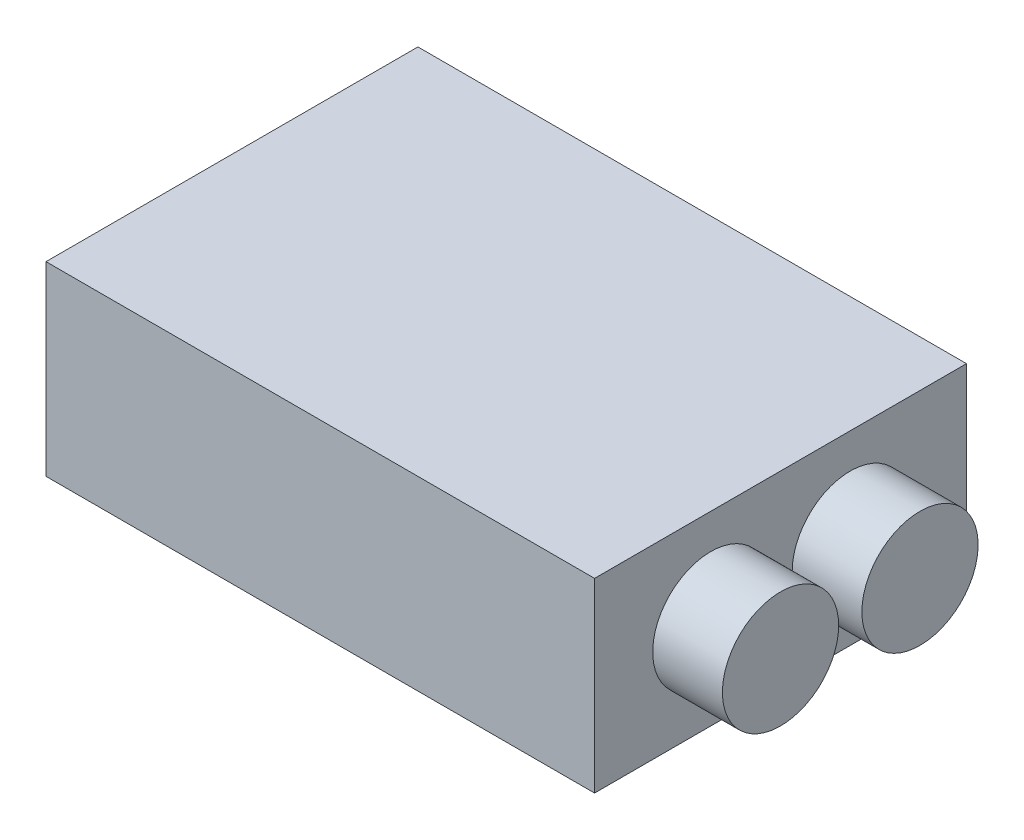
ISO-10303-21;
HEADER;
FILE_DESCRIPTION(('STEP AP214'),'2;1');
FILE_NAME('part.step','',(''),(''),'','','');
FILE_SCHEMA(('AUTOMOTIVE_DESIGN { 1 0 10303 214 1 1 1 1 }'));
ENDSEC;
DATA;
#1=APPLICATION_CONTEXT('core data for automotive mechanical design processes');
#2=APPLICATION_PROTOCOL_DEFINITION('international standard','automotive_design',2000,#1);
#3=PRODUCT_CONTEXT('',#1,'mechanical');
#4=PRODUCT('Part','Part','',(#3));
#5=PRODUCT_RELATED_PRODUCT_CATEGORY('part','',(#4));
#6=PRODUCT_DEFINITION_FORMATION('','',#4);
#7=PRODUCT_DEFINITION_CONTEXT('part definition',#1,'design');
#8=PRODUCT_DEFINITION('design','',#6,#7);
#9=PRODUCT_DEFINITION_SHAPE('','',#8);
#10=(LENGTH_UNIT() NAMED_UNIT(*) SI_UNIT(.MILLI.,.METRE.));
#11=(NAMED_UNIT(*) PLANE_ANGLE_UNIT() SI_UNIT($,.RADIAN.));
#12=(NAMED_UNIT(*) SI_UNIT($,.STERADIAN.) SOLID_ANGLE_UNIT());
#13=UNCERTAINTY_MEASURE_WITH_UNIT(LENGTH_MEASURE(1.E-05),#10,'distance_accuracy_value','');
#14=(GEOMETRIC_REPRESENTATION_CONTEXT(3) GLOBAL_UNCERTAINTY_ASSIGNED_CONTEXT((#13)) GLOBAL_UNIT_ASSIGNED_CONTEXT((#10,
#11,#12)) REPRESENTATION_CONTEXT('',''));
#15=CARTESIAN_POINT('',(0.,0.,0.));
#16=DIRECTION('',(0.,0.,1.));
#17=DIRECTION('',(1.,0.,0.));
#18=AXIS2_PLACEMENT_3D('',#15,#16,#17);
#19=CARTESIAN_POINT('',(0.,40.,0.));
#20=DIRECTION('',(1.,0.,0.));
#21=DIRECTION('',(0.,0.,-1.));
#22=AXIS2_PLACEMENT_3D('',#19,#20,#21);
#23=PLANE('',#22);
#24=DIRECTION('',(0.,0.,1.));
#25=VECTOR('',#24,1.);
#26=CARTESIAN_POINT('',(0.,0.,0.));
#27=LINE('',#26,#25);
#28=CARTESIAN_POINT('',(0.,0.,0.));
#29=VERTEX_POINT('',#28);
#30=CARTESIAN_POINT('',(0.,0.,80.));
#31=VERTEX_POINT('',#30);
#32=EDGE_CURVE('E115',#29,#31,#27,.T.);
#33=ORIENTED_EDGE('',*,*,#32,.T.);
#34=DIRECTION('',(0.,-1.,0.));
#35=VECTOR('',#34,1.);
#36=CARTESIAN_POINT('',(0.,40.,80.));
#37=LINE('',#36,#35);
#38=CARTESIAN_POINT('',(0.,40.,80.));
#39=VERTEX_POINT('',#38);
#40=EDGE_CURVE('E104',#39,#31,#37,.T.);
#41=ORIENTED_EDGE('',*,*,#40,.F.);
#42=DIRECTION('',(0.,0.,1.));
#43=VECTOR('',#42,1.);
#44=CARTESIAN_POINT('',(0.,40.,0.));
#45=LINE('',#44,#43);
#46=CARTESIAN_POINT('',(0.,40.,0.));
#47=VERTEX_POINT('',#46);
#48=EDGE_CURVE('E96',#47,#39,#45,.T.);
#49=ORIENTED_EDGE('',*,*,#48,.F.);
#50=DIRECTION('',(0.,-1.,0.));
#51=VECTOR('',#50,1.);
#52=CARTESIAN_POINT('',(0.,40.,0.));
#53=LINE('',#52,#51);
#54=EDGE_CURVE('E111',#47,#29,#53,.T.);
#55=ORIENTED_EDGE('',*,*,#54,.T.);
#56=EDGE_LOOP('',(#33,#41,#49,#55));
#57=FACE_BOUND('',#56,.T.);
#58=ADVANCED_FACE('F43',(#57),#23,.F.);
#59=CARTESIAN_POINT('',(0.,40.,80.));
#60=DIRECTION('',(0.,0.,-1.));
#61=DIRECTION('',(-1.,0.,0.));
#62=AXIS2_PLACEMENT_3D('',#59,#60,#61);
#63=PLANE('',#62);
#64=DIRECTION('',(1.,0.,0.));
#65=VECTOR('',#64,1.);
#66=CARTESIAN_POINT('',(0.,0.,80.));
#67=LINE('',#66,#65);
#68=CARTESIAN_POINT('',(118.,0.,80.));
#69=VERTEX_POINT('',#68);
#70=EDGE_CURVE('E102',#31,#69,#67,.T.);
#71=ORIENTED_EDGE('',*,*,#70,.T.);
#72=DIRECTION('',(0.,-1.,0.));
#73=VECTOR('',#72,1.);
#74=CARTESIAN_POINT('',(118.,40.,80.));
#75=LINE('',#74,#73);
#76=CARTESIAN_POINT('',(118.,40.,80.));
#77=VERTEX_POINT('',#76);
#78=EDGE_CURVE('E100',#77,#69,#75,.T.);
#79=ORIENTED_EDGE('',*,*,#78,.F.);
#80=DIRECTION('',(1.,0.,0.));
#81=VECTOR('',#80,1.);
#82=CARTESIAN_POINT('',(0.,40.,80.));
#83=LINE('',#82,#81);
#84=EDGE_CURVE('E91',#39,#77,#83,.T.);
#85=ORIENTED_EDGE('',*,*,#84,.F.);
#86=ORIENTED_EDGE('',*,*,#40,.T.);
#87=EDGE_LOOP('',(#71,#79,#85,#86));
#88=FACE_BOUND('',#87,.T.);
#89=ADVANCED_FACE('F101',(#88),#63,.F.);
#90=CARTESIAN_POINT('',(118.,40.,0.));
#91=DIRECTION('',(-1.,0.,0.));
#92=DIRECTION('',(0.,0.,1.));
#93=AXIS2_PLACEMENT_3D('',#90,#91,#92);
#94=PLANE('',#93);
#95=CARTESIAN_POINT('',(118.,20.,25.));
#96=DIRECTION('',(-1.,0.,0.));
#97=DIRECTION('',(0.,0.,1.));
#98=AXIS2_PLACEMENT_3D('',#95,#96,#97);
#99=CIRCLE('',#98,12.5);
#100=CARTESIAN_POINT('',(118.,20.,37.5));
#101=VERTEX_POINT('',#100);
#102=EDGE_CURVE('E11',#101,#101,#99,.F.);
#103=ORIENTED_EDGE('',*,*,#102,.F.);
#104=EDGE_LOOP('',(#103));
#105=FACE_BOUND('',#104,.T.);
#106=CARTESIAN_POINT('',(118.,20.,55.));
#107=DIRECTION('',(1.,0.,0.));
#108=DIRECTION('',(0.,0.,-1.));
#109=AXIS2_PLACEMENT_3D('',#106,#107,#108);
#110=CIRCLE('',#109,12.5);
#111=CARTESIAN_POINT('',(118.,20.,42.5));
#112=VERTEX_POINT('',#111);
#113=EDGE_CURVE('E52',#112,#112,#110,.T.);
#114=ORIENTED_EDGE('',*,*,#113,.F.);
#115=EDGE_LOOP('',(#114));
#116=FACE_BOUND('',#115,.T.);
#117=DIRECTION('',(0.,0.,-1.));
#118=VECTOR('',#117,1.);
#119=CARTESIAN_POINT('',(118.,0.,0.));
#120=LINE('',#119,#118);
#121=CARTESIAN_POINT('',(118.,0.,0.));
#122=VERTEX_POINT('',#121);
#123=EDGE_CURVE('E77',#69,#122,#120,.T.);
#124=ORIENTED_EDGE('',*,*,#123,.T.);
#125=DIRECTION('',(0.,-1.,0.));
#126=VECTOR('',#125,1.);
#127=CARTESIAN_POINT('',(118.,40.,0.));
#128=LINE('',#127,#126);
#129=CARTESIAN_POINT('',(118.,40.,0.));
#130=VERTEX_POINT('',#129);
#131=EDGE_CURVE('E105',#130,#122,#128,.T.);
#132=ORIENTED_EDGE('',*,*,#131,.F.);
#133=DIRECTION('',(0.,0.,-1.));
#134=VECTOR('',#133,1.);
#135=CARTESIAN_POINT('',(118.,40.,0.));
#136=LINE('',#135,#134);
#137=EDGE_CURVE('E94',#77,#130,#136,.T.);
#138=ORIENTED_EDGE('',*,*,#137,.F.);
#139=ORIENTED_EDGE('',*,*,#78,.T.);
#140=EDGE_LOOP('',(#124,#132,#138,#139));
#141=FACE_BOUND('',#140,.T.);
#142=ADVANCED_FACE('F107',(#105,#116,#141),#94,.F.);
#143=CARTESIAN_POINT('',(0.,40.,0.));
#144=DIRECTION('',(0.,0.,1.));
#145=DIRECTION('',(1.,0.,0.));
#146=AXIS2_PLACEMENT_3D('',#143,#144,#145);
#147=PLANE('',#146);
#148=DIRECTION('',(-1.,0.,0.));
#149=VECTOR('',#148,1.);
#150=CARTESIAN_POINT('',(0.,0.,0.));
#151=LINE('',#150,#149);
#152=EDGE_CURVE('E83',#122,#29,#151,.T.);
#153=ORIENTED_EDGE('',*,*,#152,.T.);
#154=ORIENTED_EDGE('',*,*,#54,.F.);
#155=DIRECTION('',(-1.,0.,0.));
#156=VECTOR('',#155,1.);
#157=CARTESIAN_POINT('',(0.,40.,0.));
#158=LINE('',#157,#156);
#159=EDGE_CURVE('E60',#130,#47,#158,.T.);
#160=ORIENTED_EDGE('',*,*,#159,.F.);
#161=ORIENTED_EDGE('',*,*,#131,.T.);
#162=EDGE_LOOP('',(#153,#154,#160,#161));
#163=FACE_BOUND('',#162,.T.);
#164=ADVANCED_FACE('F156',(#163),#147,.F.);
#165=CARTESIAN_POINT('',(0.,40.,0.));
#166=DIRECTION('',(0.,1.,0.));
#167=DIRECTION('',(0.,0.,1.));
#168=AXIS2_PLACEMENT_3D('',#165,#166,#167);
#169=PLANE('',#168);
#170=ORIENTED_EDGE('',*,*,#48,.T.);
#171=ORIENTED_EDGE('',*,*,#84,.T.);
#172=ORIENTED_EDGE('',*,*,#137,.T.);
#173=ORIENTED_EDGE('',*,*,#159,.T.);
#174=EDGE_LOOP('',(#170,#171,#172,#173));
#175=FACE_BOUND('',#174,.T.);
#176=ADVANCED_FACE('F92',(#175),#169,.T.);
#177=CARTESIAN_POINT('',(0.,0.,0.));
#178=DIRECTION('',(0.,1.,0.));
#179=DIRECTION('',(0.,0.,1.));
#180=AXIS2_PLACEMENT_3D('',#177,#178,#179);
#181=PLANE('',#180);
#182=ORIENTED_EDGE('',*,*,#32,.F.);
#183=ORIENTED_EDGE('',*,*,#152,.F.);
#184=ORIENTED_EDGE('',*,*,#123,.F.);
#185=ORIENTED_EDGE('',*,*,#70,.F.);
#186=EDGE_LOOP('',(#182,#183,#184,#185));
#187=FACE_BOUND('',#186,.T.);
#188=ADVANCED_FACE('F169',(#187),#181,.F.);
#189=CARTESIAN_POINT('',(133.,20.,55.));
#190=DIRECTION('',(-1.,0.,0.));
#191=DIRECTION('',(0.,0.,1.));
#192=AXIS2_PLACEMENT_3D('',#189,#190,#191);
#193=CYLINDRICAL_SURFACE('',#192,12.5);
#194=CARTESIAN_POINT('',(133.,20.,55.));
#195=DIRECTION('',(1.,0.,0.));
#196=DIRECTION('',(0.,0.,-1.));
#197=AXIS2_PLACEMENT_3D('',#194,#195,#196);
#198=CIRCLE('',#197,12.5);
#199=CARTESIAN_POINT('',(133.,20.,42.5));
#200=VERTEX_POINT('',#199);
#201=EDGE_CURVE('E119',#200,#200,#198,.T.);
#202=ORIENTED_EDGE('',*,*,#201,.F.);
#203=EDGE_LOOP('',(#202));
#204=FACE_BOUND('',#203,.T.);
#205=ORIENTED_EDGE('',*,*,#113,.T.);
#206=EDGE_LOOP('',(#205));
#207=FACE_BOUND('',#206,.T.);
#208=ADVANCED_FACE('F171',(#204,#207),#193,.T.);
#209=CARTESIAN_POINT('',(133.,20.,55.));
#210=DIRECTION('',(1.,0.,0.));
#211=DIRECTION('',(0.,0.,-1.));
#212=AXIS2_PLACEMENT_3D('',#209,#210,#211);
#213=PLANE('',#212);
#214=ORIENTED_EDGE('',*,*,#201,.T.);
#215=EDGE_LOOP('',(#214));
#216=FACE_BOUND('',#215,.T.);
#217=ADVANCED_FACE('F150',(#216),#213,.T.);
#218=CARTESIAN_POINT('',(133.,20.,25.));
#219=DIRECTION('',(-1.,0.,0.));
#220=DIRECTION('',(0.,0.,1.));
#221=AXIS2_PLACEMENT_3D('',#218,#219,#220);
#222=CYLINDRICAL_SURFACE('',#221,12.5);
#223=CARTESIAN_POINT('',(133.,20.,25.));
#224=DIRECTION('',(1.,0.,0.));
#225=DIRECTION('',(0.,0.,1.));
#226=AXIS2_PLACEMENT_3D('',#223,#224,#225);
#227=CIRCLE('',#226,12.5);
#228=CARTESIAN_POINT('',(133.,20.,37.5));
#229=VERTEX_POINT('',#228);
#230=EDGE_CURVE('E141',#229,#229,#227,.T.);
#231=ORIENTED_EDGE('',*,*,#230,.F.);
#232=EDGE_LOOP('',(#231));
#233=FACE_BOUND('',#232,.T.);
#234=ORIENTED_EDGE('',*,*,#102,.T.);
#235=EDGE_LOOP('',(#234));
#236=FACE_BOUND('',#235,.T.);
#237=ADVANCED_FACE('F147',(#233,#236),#222,.T.);
#238=CARTESIAN_POINT('',(133.,20.,25.));
#239=DIRECTION('',(-1.,0.,0.));
#240=DIRECTION('',(0.,0.,1.));
#241=AXIS2_PLACEMENT_3D('',#238,#239,#240);
#242=PLANE('',#241);
#243=ORIENTED_EDGE('',*,*,#230,.T.);
#244=EDGE_LOOP('',(#243));
#245=FACE_BOUND('',#244,.T.);
#246=ADVANCED_FACE('F145',(#245),#242,.F.);
#247=CLOSED_SHELL('',(#58,#89,#142,#164,#176,#188,#208,#217,#237,#246));
#248=MANIFOLD_SOLID_BREP('B2',#247);
#249=ADVANCED_BREP_SHAPE_REPRESENTATION('',(#18,#248),#14);
#250=SHAPE_DEFINITION_REPRESENTATION(#9,#249);
ENDSEC;
END-ISO-10303-21;
